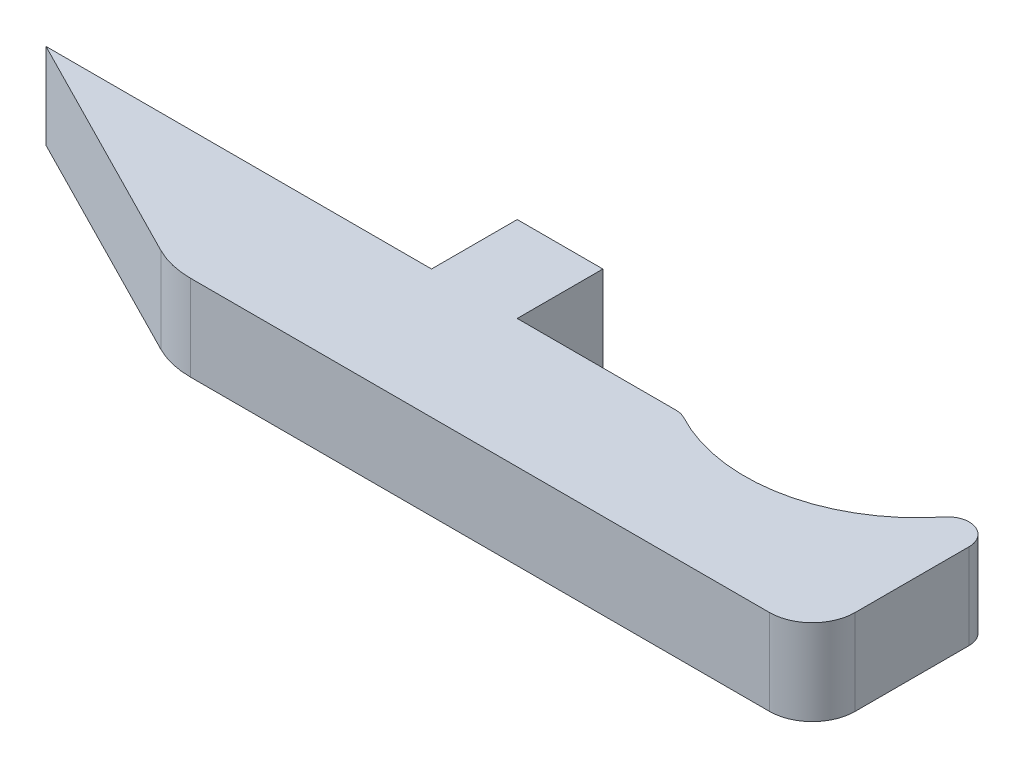
ISO-10303-21;
HEADER;
FILE_DESCRIPTION(('STEP AP214'),'2;1');
FILE_NAME('part.step','',(''),(''),'','','');
FILE_SCHEMA(('AUTOMOTIVE_DESIGN { 1 0 10303 214 1 1 1 1 }'));
ENDSEC;
DATA;
#1=APPLICATION_CONTEXT('core data for automotive mechanical design processes');
#2=APPLICATION_PROTOCOL_DEFINITION('international standard','automotive_design',2000,#1);
#3=PRODUCT_CONTEXT('',#1,'mechanical');
#4=PRODUCT('Part','Part','',(#3));
#5=PRODUCT_RELATED_PRODUCT_CATEGORY('part','',(#4));
#6=PRODUCT_DEFINITION_FORMATION('','',#4);
#7=PRODUCT_DEFINITION_CONTEXT('part definition',#1,'design');
#8=PRODUCT_DEFINITION('design','',#6,#7);
#9=PRODUCT_DEFINITION_SHAPE('','',#8);
#10=(LENGTH_UNIT() NAMED_UNIT(*) SI_UNIT(.MILLI.,.METRE.));
#11=(NAMED_UNIT(*) PLANE_ANGLE_UNIT() SI_UNIT($,.RADIAN.));
#12=(NAMED_UNIT(*) SI_UNIT($,.STERADIAN.) SOLID_ANGLE_UNIT());
#13=UNCERTAINTY_MEASURE_WITH_UNIT(LENGTH_MEASURE(1.E-05),#10,'distance_accuracy_value','');
#14=(GEOMETRIC_REPRESENTATION_CONTEXT(3) GLOBAL_UNCERTAINTY_ASSIGNED_CONTEXT((#13)) GLOBAL_UNIT_ASSIGNED_CONTEXT((#10,
#11,#12)) REPRESENTATION_CONTEXT('',''));
#15=CARTESIAN_POINT('',(0.,0.,0.));
#16=DIRECTION('',(0.,0.,1.));
#17=DIRECTION('',(1.,0.,0.));
#18=AXIS2_PLACEMENT_3D('',#15,#16,#17);
#19=CARTESIAN_POINT('',(0.,6.35,13.8171684160711));
#20=DIRECTION('',(0.,0.,1.));
#21=DIRECTION('',(1.,0.,0.));
#22=AXIS2_PLACEMENT_3D('',#19,#20,#21);
#23=PLANE('',#22);
#24=DIRECTION('',(0.,-1.,0.));
#25=VECTOR('',#24,1.);
#26=CARTESIAN_POINT('',(40.4474999999188,6.35,13.8171684160711));
#27=LINE('',#26,#25);
#28=CARTESIAN_POINT('',(40.4474999999194,6.35,13.8171684160711));
#29=VERTEX_POINT('',#28);
#30=CARTESIAN_POINT('',(40.4474999999194,0.,13.8171684160711));
#31=VERTEX_POINT('',#30);
#32=EDGE_CURVE('E71',#29,#31,#27,.T.);
#33=ORIENTED_EDGE('',*,*,#32,.F.);
#34=DIRECTION('',(-1.,0.,0.));
#35=VECTOR('',#34,1.);
#36=CARTESIAN_POINT('',(0.,6.35,13.8171684160711));
#37=LINE('',#36,#35);
#38=CARTESIAN_POINT('',(52.2236118690828,6.35,13.8171684160711));
#39=VERTEX_POINT('',#38);
#40=EDGE_CURVE('E187',#39,#29,#37,.T.);
#41=ORIENTED_EDGE('',*,*,#40,.F.);
#42=DIRECTION('',(0.,1.,0.));
#43=VECTOR('',#42,1.);
#44=CARTESIAN_POINT('',(52.2236118690828,0.,13.8171684160711));
#45=LINE('',#44,#43);
#46=CARTESIAN_POINT('',(52.2236118690828,0.,13.8171684160711));
#47=VERTEX_POINT('',#46);
#48=EDGE_CURVE('E219',#39,#47,#45,.F.);
#49=ORIENTED_EDGE('',*,*,#48,.T.);
#50=DIRECTION('',(-1.,0.,0.));
#51=VECTOR('',#50,1.);
#52=CARTESIAN_POINT('',(0.,0.,13.8171684160711));
#53=LINE('',#52,#51);
#54=EDGE_CURVE('E203',#47,#31,#53,.T.);
#55=ORIENTED_EDGE('',*,*,#54,.T.);
#56=EDGE_LOOP('',(#33,#41,#49,#55));
#57=FACE_BOUND('',#56,.T.);
#58=ADVANCED_FACE('F47',(#57),#23,.F.);
#59=DIRECTION('',(0.,1.,0.));
#60=VECTOR('',#59,1.);
#61=CARTESIAN_POINT('',(34.0974999999188,6.35,13.8171684160711));
#62=LINE('',#61,#60);
#63=CARTESIAN_POINT('',(34.0974999999194,0.,13.8171684160711));
#64=VERTEX_POINT('',#63);
#65=CARTESIAN_POINT('',(34.0974999999188,6.35,13.8171684160711));
#66=VERTEX_POINT('',#65);
#67=EDGE_CURVE('E167',#64,#66,#62,.T.);
#68=ORIENTED_EDGE('',*,*,#67,.F.);
#69=CARTESIAN_POINT('',(5.52249999991881,0.,13.8171684160711));
#70=VERTEX_POINT('',#69);
#71=EDGE_CURVE('E176',#64,#70,#53,.T.);
#72=ORIENTED_EDGE('',*,*,#71,.T.);
#73=DIRECTION('',(0.,-1.,0.));
#74=VECTOR('',#73,1.);
#75=CARTESIAN_POINT('',(5.52249999991881,6.35,13.8171684160711));
#76=LINE('',#75,#74);
#77=CARTESIAN_POINT('',(5.52249999991881,6.35,13.8171684160711));
#78=VERTEX_POINT('',#77);
#79=EDGE_CURVE('E201',#78,#70,#76,.T.);
#80=ORIENTED_EDGE('',*,*,#79,.F.);
#81=EDGE_CURVE('E63',#66,#78,#37,.T.);
#82=ORIENTED_EDGE('',*,*,#81,.F.);
#83=EDGE_LOOP('',(#68,#72,#80,#82));
#84=FACE_BOUND('',#83,.T.);
#85=ADVANCED_FACE('F313',(#84),#23,.F.);
#86=CARTESIAN_POINT('',(59.0180999999136,6.35,2.69196841607107));
#87=DIRECTION('',(0.,-1.,0.));
#88=DIRECTION('',(0.,0.,-1.));
#89=AXIS2_PLACEMENT_3D('',#86,#87,#88);
#90=CYLINDRICAL_SURFACE('',#89,12.827);
#91=CARTESIAN_POINT('',(59.0180999999136,0.,2.69196841607107));
#92=DIRECTION('',(0.,1.,0.));
#93=DIRECTION('',(0.,0.,1.));
#94=AXIS2_PLACEMENT_3D('',#91,#92,#93);
#95=CIRCLE('',#94,12.827);
#96=CARTESIAN_POINT('',(52.9719035134474,0.,14.0045913235601));
#97=VERTEX_POINT('',#96);
#98=CARTESIAN_POINT('',(69.0197696034378,0.,10.7230663573204));
#99=VERTEX_POINT('',#98);
#100=EDGE_CURVE('E171',#97,#99,#95,.T.);
#101=ORIENTED_EDGE('',*,*,#100,.F.);
#102=DIRECTION('',(0.,-1.,0.));
#103=VECTOR('',#102,1.);
#104=CARTESIAN_POINT('',(52.9719035134474,6.35,14.0045913235601));
#105=LINE('',#104,#103);
#106=CARTESIAN_POINT('',(52.9719035134474,6.35,14.0045913235601));
#107=VERTEX_POINT('',#106);
#108=EDGE_CURVE('E233',#97,#107,#105,.F.);
#109=ORIENTED_EDGE('',*,*,#108,.T.);
#110=CARTESIAN_POINT('',(59.0180999999136,6.35,2.69196841607107));
#111=DIRECTION('',(0.,1.,0.));
#112=DIRECTION('',(0.,0.,1.));
#113=AXIS2_PLACEMENT_3D('',#110,#111,#112);
#114=CIRCLE('',#113,12.827);
#115=CARTESIAN_POINT('',(69.0197696034378,6.35,10.7230663573204));
#116=VERTEX_POINT('',#115);
#117=EDGE_CURVE('E182',#107,#116,#114,.T.);
#118=ORIENTED_EDGE('',*,*,#117,.T.);
#119=DIRECTION('',(0.,-1.,0.));
#120=VECTOR('',#119,1.);
#121=CARTESIAN_POINT('',(69.0197696034378,6.35,10.7230663573204));
#122=LINE('',#121,#120);
#123=EDGE_CURVE('E229',#116,#99,#122,.T.);
#124=ORIENTED_EDGE('',*,*,#123,.T.);
#125=EDGE_LOOP('',(#101,#109,#118,#124));
#126=FACE_BOUND('',#125,.T.);
#127=ADVANCED_FACE('F288',(#126),#90,.F.);
#128=CARTESIAN_POINT('',(-4.45063872227655,6.35,8.73661549329288));
#129=DIRECTION('',(0.453918499731843,0.,-0.891043206360496));
#130=DIRECTION('',(-0.891043206360496,0.,-0.453918499731843));
#131=AXIS2_PLACEMENT_3D('',#128,#129,#130);
#132=PLANE('',#131);
#133=DIRECTION('',(0.891043206360496,0.,0.453918499731843));
#134=VECTOR('',#133,1.);
#135=CARTESIAN_POINT('',(-4.45063872227655,0.,8.73661549329288));
#136=LINE('',#135,#134);
#137=CARTESIAN_POINT('',(22.8619463034113,0.,22.6502927764602));
#138=VERTEX_POINT('',#137);
#139=EDGE_CURVE('E206',#70,#138,#136,.T.);
#140=ORIENTED_EDGE('',*,*,#139,.T.);
#141=DIRECTION('',(0.,-1.,0.));
#142=VECTOR('',#141,1.);
#143=CARTESIAN_POINT('',(22.8619463034113,6.35,22.6502927764602));
#144=LINE('',#143,#142);
#145=CARTESIAN_POINT('',(22.8619463034113,6.35,22.6502927764602));
#146=VERTEX_POINT('',#145);
#147=EDGE_CURVE('E252',#138,#146,#144,.F.);
#148=ORIENTED_EDGE('',*,*,#147,.T.);
#149=DIRECTION('',(0.891043206360496,0.,0.453918499731843));
#150=VECTOR('',#149,1.);
#151=CARTESIAN_POINT('',(-4.45063872227655,6.35,8.73661549329288));
#152=LINE('',#151,#150);
#153=EDGE_CURVE('E190',#78,#146,#152,.T.);
#154=ORIENTED_EDGE('',*,*,#153,.F.);
#155=ORIENTED_EDGE('',*,*,#79,.T.);
#156=EDGE_LOOP('',(#140,#148,#154,#155));
#157=FACE_BOUND('',#156,.T.);
#158=ADVANCED_FACE('F316',(#157),#132,.F.);
#159=CARTESIAN_POINT('',(0.,6.35,23.3421684160711));
#160=DIRECTION('',(0.,0.,-1.));
#161=DIRECTION('',(-1.,0.,0.));
#162=AXIS2_PLACEMENT_3D('',#159,#160,#161);
#163=PLANE('',#162);
#164=DIRECTION('',(1.,0.,0.));
#165=VECTOR('',#164,1.);
#166=CARTESIAN_POINT('',(0.,0.,23.3421684160711));
#167=LINE('',#166,#165);
#168=CARTESIAN_POINT('',(25.7443287767085,0.,23.3421684160711));
#169=VERTEX_POINT('',#168);
#170=CARTESIAN_POINT('',(68.6700999999135,0.,23.3421684160711));
#171=VERTEX_POINT('',#170);
#172=EDGE_CURVE('E210',#169,#171,#167,.T.);
#173=ORIENTED_EDGE('',*,*,#172,.T.);
#174=DIRECTION('',(0.,-1.,0.));
#175=VECTOR('',#174,1.);
#176=CARTESIAN_POINT('',(68.6700999999135,6.35,23.3421684160711));
#177=LINE('',#176,#175);
#178=CARTESIAN_POINT('',(68.6700999999135,6.35,23.3421684160711));
#179=VERTEX_POINT('',#178);
#180=EDGE_CURVE('E56',#171,#179,#177,.F.);
#181=ORIENTED_EDGE('',*,*,#180,.T.);
#182=DIRECTION('',(1.,0.,0.));
#183=VECTOR('',#182,1.);
#184=CARTESIAN_POINT('',(0.,6.35,23.3421684160711));
#185=LINE('',#184,#183);
#186=CARTESIAN_POINT('',(25.7443287767085,6.35,23.3421684160711));
#187=VERTEX_POINT('',#186);
#188=EDGE_CURVE('E194',#187,#179,#185,.T.);
#189=ORIENTED_EDGE('',*,*,#188,.F.);
#190=DIRECTION('',(0.,-1.,0.));
#191=VECTOR('',#190,1.);
#192=CARTESIAN_POINT('',(25.7443287767085,6.35,23.3421684160711));
#193=LINE('',#192,#191);
#194=EDGE_CURVE('E245',#187,#169,#193,.T.);
#195=ORIENTED_EDGE('',*,*,#194,.T.);
#196=EDGE_LOOP('',(#173,#181,#189,#195));
#197=FACE_BOUND('',#196,.T.);
#198=ADVANCED_FACE('F268',(#197),#163,.F.);
#199=CARTESIAN_POINT('',(71.8450999999136,6.35,0.));
#200=DIRECTION('',(1.,0.,0.));
#201=DIRECTION('',(0.,0.,-1.));
#202=AXIS2_PLACEMENT_3D('',#199,#200,#201);
#203=PLANE('',#202);
#204=DIRECTION('',(0.,0.,1.));
#205=VECTOR('',#204,1.);
#206=CARTESIAN_POINT('',(71.8450999999136,6.35,0.));
#207=LINE('',#206,#205);
#208=CARTESIAN_POINT('',(71.8450999999135,6.35,11.7170141223265));
#209=VERTEX_POINT('',#208);
#210=CARTESIAN_POINT('',(71.8450999999135,6.35,20.1671684160711));
#211=VERTEX_POINT('',#210);
#212=EDGE_CURVE('E198',#209,#211,#207,.T.);
#213=ORIENTED_EDGE('',*,*,#212,.T.);
#214=DIRECTION('',(0.,-1.,0.));
#215=VECTOR('',#214,1.);
#216=CARTESIAN_POINT('',(71.8450999999135,0.,20.1671684160711));
#217=LINE('',#216,#215);
#218=CARTESIAN_POINT('',(71.8450999999135,0.,20.1671684160711));
#219=VERTEX_POINT('',#218);
#220=EDGE_CURVE('E258',#211,#219,#217,.T.);
#221=ORIENTED_EDGE('',*,*,#220,.T.);
#222=DIRECTION('',(0.,0.,1.));
#223=VECTOR('',#222,1.);
#224=CARTESIAN_POINT('',(71.8450999999136,0.,0.));
#225=LINE('',#224,#223);
#226=CARTESIAN_POINT('',(71.8450999999135,0.,11.7170141223265));
#227=VERTEX_POINT('',#226);
#228=EDGE_CURVE('E186',#227,#219,#225,.T.);
#229=ORIENTED_EDGE('',*,*,#228,.F.);
#230=DIRECTION('',(0.,-1.,0.));
#231=VECTOR('',#230,1.);
#232=CARTESIAN_POINT('',(71.8450999999135,6.35,11.7170141223265));
#233=LINE('',#232,#231);
#234=EDGE_CURVE('E242',#227,#209,#233,.F.);
#235=ORIENTED_EDGE('',*,*,#234,.T.);
#236=EDGE_LOOP('',(#213,#221,#229,#235));
#237=FACE_BOUND('',#236,.T.);
#238=ADVANCED_FACE('F280',(#237),#203,.T.);
#239=CARTESIAN_POINT('',(0.,6.35,0.));
#240=DIRECTION('',(0.,1.,0.));
#241=DIRECTION('',(0.,0.,1.));
#242=AXIS2_PLACEMENT_3D('',#239,#240,#241);
#243=PLANE('',#242);
#244=ORIENTED_EDGE('',*,*,#188,.T.);
#245=CARTESIAN_POINT('',(68.6700999999135,6.35,20.1671684160711));
#246=DIRECTION('',(0.,1.,0.));
#247=DIRECTION('',(0.,0.,1.));
#248=AXIS2_PLACEMENT_3D('',#245,#246,#247);
#249=CIRCLE('',#248,3.175);
#250=EDGE_CURVE('E11',#179,#211,#249,.T.);
#251=ORIENTED_EDGE('',*,*,#250,.T.);
#252=ORIENTED_EDGE('',*,*,#212,.F.);
#253=CARTESIAN_POINT('',(70.2575999999136,6.35,11.7170141223265));
#254=DIRECTION('',(0.,1.,0.));
#255=DIRECTION('',(0.,0.,1.));
#256=AXIS2_PLACEMENT_3D('',#253,#254,#255);
#257=CIRCLE('',#256,1.5875);
#258=EDGE_CURVE('E236',#209,#116,#257,.T.);
#259=ORIENTED_EDGE('',*,*,#258,.T.);
#260=ORIENTED_EDGE('',*,*,#117,.F.);
#261=CARTESIAN_POINT('',(52.2236118690828,6.35,15.4046684160711));
#262=DIRECTION('',(0.,1.,0.));
#263=DIRECTION('',(0.,0.,1.));
#264=AXIS2_PLACEMENT_3D('',#261,#262,#263);
#265=CIRCLE('',#264,1.5875);
#266=EDGE_CURVE('E239',#107,#39,#265,.T.);
#267=ORIENTED_EDGE('',*,*,#266,.T.);
#268=ORIENTED_EDGE('',*,*,#40,.T.);
#269=DIRECTION('',(0.,0.,1.));
#270=VECTOR('',#269,1.);
#271=CARTESIAN_POINT('',(40.4474999999188,6.35,7.46716841607107));
#272=LINE('',#271,#270);
#273=CARTESIAN_POINT('',(40.4474999999188,6.35,7.46716841607107));
#274=VERTEX_POINT('',#273);
#275=EDGE_CURVE('E295',#274,#29,#272,.T.);
#276=ORIENTED_EDGE('',*,*,#275,.F.);
#277=DIRECTION('',(1.,0.,0.));
#278=VECTOR('',#277,1.);
#279=CARTESIAN_POINT('',(40.4474999999188,6.35,7.46716841607107));
#280=LINE('',#279,#278);
#281=CARTESIAN_POINT('',(34.0974999999188,6.35,7.46716841607107));
#282=VERTEX_POINT('',#281);
#283=EDGE_CURVE('E162',#282,#274,#280,.T.);
#284=ORIENTED_EDGE('',*,*,#283,.F.);
#285=DIRECTION('',(0.,0.,1.));
#286=VECTOR('',#285,1.);
#287=CARTESIAN_POINT('',(34.0974999999188,6.35,7.46716841607107));
#288=LINE('',#287,#286);
#289=EDGE_CURVE('E178',#282,#66,#288,.T.);
#290=ORIENTED_EDGE('',*,*,#289,.T.);
#291=ORIENTED_EDGE('',*,*,#81,.T.);
#292=ORIENTED_EDGE('',*,*,#153,.T.);
#293=CARTESIAN_POINT('',(25.7443287767085,6.35,16.9921684160711));
#294=DIRECTION('',(0.,1.,0.));
#295=DIRECTION('',(0.,0.,1.));
#296=AXIS2_PLACEMENT_3D('',#293,#294,#295);
#297=CIRCLE('',#296,6.35);
#298=EDGE_CURVE('E255',#146,#187,#297,.T.);
#299=ORIENTED_EDGE('',*,*,#298,.T.);
#300=EDGE_LOOP('',(#244,#251,#252,#259,#260,#267,#268,#276,#284,#290,#291,#292,#299));
#301=FACE_BOUND('',#300,.T.);
#302=ADVANCED_FACE('F274',(#301),#243,.T.);
#303=CARTESIAN_POINT('',(0.,0.,0.));
#304=DIRECTION('',(0.,1.,0.));
#305=DIRECTION('',(0.,0.,1.));
#306=AXIS2_PLACEMENT_3D('',#303,#304,#305);
#307=PLANE('',#306);
#308=ORIENTED_EDGE('',*,*,#228,.T.);
#309=CARTESIAN_POINT('',(68.6700999999135,0.,20.1671684160711));
#310=DIRECTION('',(0.,1.,0.));
#311=DIRECTION('',(0.,0.,1.));
#312=AXIS2_PLACEMENT_3D('',#309,#310,#311);
#313=CIRCLE('',#312,3.175);
#314=EDGE_CURVE('E262',#219,#171,#313,.F.);
#315=ORIENTED_EDGE('',*,*,#314,.T.);
#316=ORIENTED_EDGE('',*,*,#172,.F.);
#317=CARTESIAN_POINT('',(25.7443287767085,0.,16.9921684160711));
#318=DIRECTION('',(0.,1.,0.));
#319=DIRECTION('',(0.,0.,1.));
#320=AXIS2_PLACEMENT_3D('',#317,#318,#319);
#321=CIRCLE('',#320,6.35);
#322=EDGE_CURVE('E249',#169,#138,#321,.F.);
#323=ORIENTED_EDGE('',*,*,#322,.T.);
#324=ORIENTED_EDGE('',*,*,#139,.F.);
#325=ORIENTED_EDGE('',*,*,#71,.F.);
#326=DIRECTION('',(0.,0.,1.));
#327=VECTOR('',#326,1.);
#328=CARTESIAN_POINT('',(34.0974999999194,0.,7.46716841607107));
#329=LINE('',#328,#327);
#330=CARTESIAN_POINT('',(34.0974999999194,0.,7.46716841607107));
#331=VERTEX_POINT('',#330);
#332=EDGE_CURVE('E152',#331,#64,#329,.T.);
#333=ORIENTED_EDGE('',*,*,#332,.F.);
#334=DIRECTION('',(-1.,0.,0.));
#335=VECTOR('',#334,1.);
#336=CARTESIAN_POINT('',(40.4474999999194,0.,7.46716841607107));
#337=LINE('',#336,#335);
#338=CARTESIAN_POINT('',(40.4474999999194,0.,7.46716841607107));
#339=VERTEX_POINT('',#338);
#340=EDGE_CURVE('E144',#339,#331,#337,.T.);
#341=ORIENTED_EDGE('',*,*,#340,.F.);
#342=DIRECTION('',(0.,0.,1.));
#343=VECTOR('',#342,1.);
#344=CARTESIAN_POINT('',(40.4474999999194,0.,7.46716841607107));
#345=LINE('',#344,#343);
#346=EDGE_CURVE('E150',#339,#31,#345,.T.);
#347=ORIENTED_EDGE('',*,*,#346,.T.);
#348=ORIENTED_EDGE('',*,*,#54,.F.);
#349=CARTESIAN_POINT('',(52.2236118690828,0.,15.4046684160711));
#350=DIRECTION('',(0.,1.,0.));
#351=DIRECTION('',(0.,0.,1.));
#352=AXIS2_PLACEMENT_3D('',#349,#350,#351);
#353=CIRCLE('',#352,1.5875);
#354=EDGE_CURVE('E226',#47,#97,#353,.F.);
#355=ORIENTED_EDGE('',*,*,#354,.T.);
#356=ORIENTED_EDGE('',*,*,#100,.T.);
#357=CARTESIAN_POINT('',(70.2575999999136,0.,11.7170141223265));
#358=DIRECTION('',(0.,1.,0.));
#359=DIRECTION('',(0.,0.,1.));
#360=AXIS2_PLACEMENT_3D('',#357,#358,#359);
#361=CIRCLE('',#360,1.5875);
#362=EDGE_CURVE('E223',#99,#227,#361,.F.);
#363=ORIENTED_EDGE('',*,*,#362,.T.);
#364=EDGE_LOOP('',(#308,#315,#316,#323,#324,#325,#333,#341,#347,#348,#355,#356,#363));
#365=FACE_BOUND('',#364,.T.);
#366=ADVANCED_FACE('F147',(#365),#307,.F.);
#367=CARTESIAN_POINT('',(52.2236118690828,6.35,15.4046684160711));
#368=DIRECTION('',(0.,-1.,0.));
#369=DIRECTION('',(0.,0.,-1.));
#370=AXIS2_PLACEMENT_3D('',#367,#368,#369);
#371=CYLINDRICAL_SURFACE('',#370,1.5875);
#372=ORIENTED_EDGE('',*,*,#266,.F.);
#373=ORIENTED_EDGE('',*,*,#108,.F.);
#374=ORIENTED_EDGE('',*,*,#354,.F.);
#375=ORIENTED_EDGE('',*,*,#48,.F.);
#376=EDGE_LOOP('',(#372,#373,#374,#375));
#377=FACE_BOUND('',#376,.T.);
#378=ADVANCED_FACE('F294',(#377),#371,.T.);
#379=CARTESIAN_POINT('',(70.2575999999136,6.35,11.7170141223265));
#380=DIRECTION('',(0.,-1.,0.));
#381=DIRECTION('',(0.,0.,-1.));
#382=AXIS2_PLACEMENT_3D('',#379,#380,#381);
#383=CYLINDRICAL_SURFACE('',#382,1.5875);
#384=ORIENTED_EDGE('',*,*,#258,.F.);
#385=ORIENTED_EDGE('',*,*,#234,.F.);
#386=ORIENTED_EDGE('',*,*,#362,.F.);
#387=ORIENTED_EDGE('',*,*,#123,.F.);
#388=EDGE_LOOP('',(#384,#385,#386,#387));
#389=FACE_BOUND('',#388,.T.);
#390=ADVANCED_FACE('F286',(#389),#383,.T.);
#391=CARTESIAN_POINT('',(25.7443287767085,6.35,16.9921684160711));
#392=DIRECTION('',(0.,-1.,0.));
#393=DIRECTION('',(0.,0.,-1.));
#394=AXIS2_PLACEMENT_3D('',#391,#392,#393);
#395=CYLINDRICAL_SURFACE('',#394,6.35);
#396=ORIENTED_EDGE('',*,*,#298,.F.);
#397=ORIENTED_EDGE('',*,*,#147,.F.);
#398=ORIENTED_EDGE('',*,*,#322,.F.);
#399=ORIENTED_EDGE('',*,*,#194,.F.);
#400=EDGE_LOOP('',(#396,#397,#398,#399));
#401=FACE_BOUND('',#400,.T.);
#402=ADVANCED_FACE('F319',(#401),#395,.T.);
#403=CARTESIAN_POINT('',(68.6700999999135,6.35,20.1671684160711));
#404=DIRECTION('',(0.,1.,0.));
#405=DIRECTION('',(0.,0.,1.));
#406=AXIS2_PLACEMENT_3D('',#403,#404,#405);
#407=CYLINDRICAL_SURFACE('',#406,3.175);
#408=ORIENTED_EDGE('',*,*,#250,.F.);
#409=ORIENTED_EDGE('',*,*,#180,.F.);
#410=ORIENTED_EDGE('',*,*,#314,.F.);
#411=ORIENTED_EDGE('',*,*,#220,.F.);
#412=EDGE_LOOP('',(#408,#409,#410,#411));
#413=FACE_BOUND('',#412,.T.);
#414=ADVANCED_FACE('F49',(#413),#407,.T.);
#415=CARTESIAN_POINT('',(40.4474999999188,6.35,7.46716841607107));
#416=DIRECTION('',(-1.,0.,0.));
#417=DIRECTION('',(0.,-1.,0.));
#418=AXIS2_PLACEMENT_3D('',#415,#416,#417);
#419=PLANE('',#418);
#420=ORIENTED_EDGE('',*,*,#32,.T.);
#421=ORIENTED_EDGE('',*,*,#346,.F.);
#422=DIRECTION('',(0.,-1.,0.));
#423=VECTOR('',#422,1.);
#424=CARTESIAN_POINT('',(40.4474999999188,6.35,7.46716841607107));
#425=LINE('',#424,#423);
#426=EDGE_CURVE('E157',#274,#339,#425,.T.);
#427=ORIENTED_EDGE('',*,*,#426,.F.);
#428=ORIENTED_EDGE('',*,*,#275,.T.);
#429=EDGE_LOOP('',(#420,#421,#427,#428));
#430=FACE_BOUND('',#429,.T.);
#431=ADVANCED_FACE('F169',(#430),#419,.F.);
#432=CARTESIAN_POINT('',(34.0974999999188,6.35,7.46716841607107));
#433=DIRECTION('',(1.,0.,0.));
#434=DIRECTION('',(0.,1.,0.));
#435=AXIS2_PLACEMENT_3D('',#432,#433,#434);
#436=PLANE('',#435);
#437=ORIENTED_EDGE('',*,*,#67,.T.);
#438=ORIENTED_EDGE('',*,*,#289,.F.);
#439=DIRECTION('',(0.,1.,0.));
#440=VECTOR('',#439,1.);
#441=CARTESIAN_POINT('',(34.0974999999188,6.35,7.46716841607107));
#442=LINE('',#441,#440);
#443=EDGE_CURVE('E156',#331,#282,#442,.T.);
#444=ORIENTED_EDGE('',*,*,#443,.F.);
#445=ORIENTED_EDGE('',*,*,#332,.T.);
#446=EDGE_LOOP('',(#437,#438,#444,#445));
#447=FACE_BOUND('',#446,.T.);
#448=ADVANCED_FACE('F310',(#447),#436,.F.);
#449=CARTESIAN_POINT('',(0.,0.,7.46716841607108));
#450=DIRECTION('',(0.,0.,-1.));
#451=DIRECTION('',(-1.,0.,0.));
#452=AXIS2_PLACEMENT_3D('',#449,#450,#451);
#453=PLANE('',#452);
#454=ORIENTED_EDGE('',*,*,#426,.T.);
#455=ORIENTED_EDGE('',*,*,#340,.T.);
#456=ORIENTED_EDGE('',*,*,#443,.T.);
#457=ORIENTED_EDGE('',*,*,#283,.T.);
#458=EDGE_LOOP('',(#454,#455,#456,#457));
#459=FACE_BOUND('',#458,.T.);
#460=ADVANCED_FACE('F160',(#459),#453,.T.);
#461=CLOSED_SHELL('',(#58,#85,#127,#158,#198,#238,#302,#366,#378,#390,#402,#414,#431,#448,#460));
#462=MANIFOLD_SOLID_BREP('B2',#461);
#463=ADVANCED_BREP_SHAPE_REPRESENTATION('',(#18,#462),#14);
#464=SHAPE_DEFINITION_REPRESENTATION(#9,#463);
ENDSEC;
END-ISO-10303-21;
